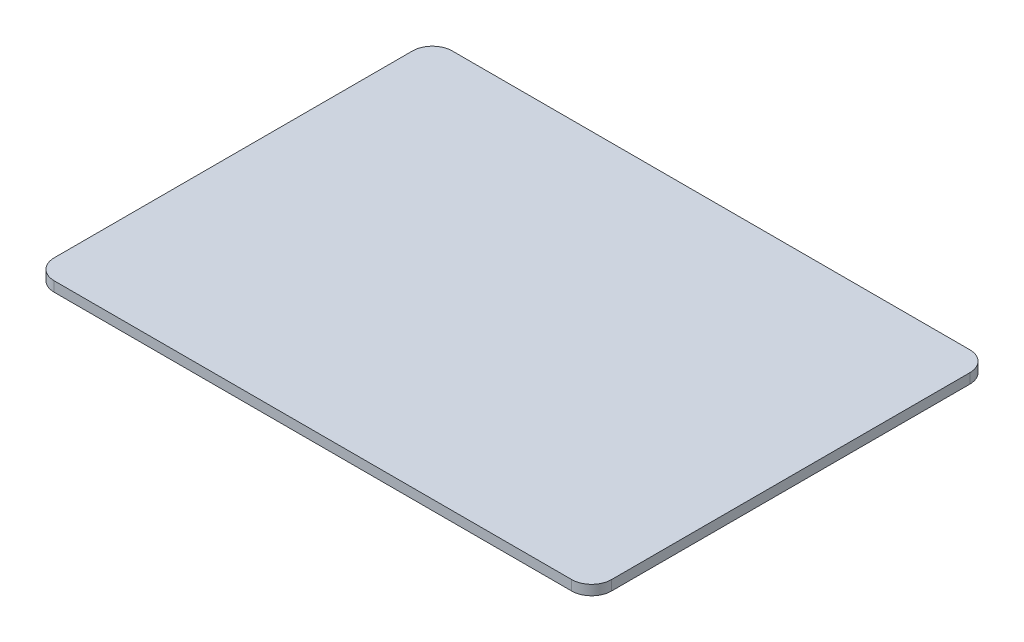
ISO-10303-21;
HEADER;
FILE_DESCRIPTION(('STEP AP214'),'2;1');
FILE_NAME('part.step','',(''),(''),'','','');
FILE_SCHEMA(('AUTOMOTIVE_DESIGN { 1 0 10303 214 1 1 1 1 }'));
ENDSEC;
DATA;
#1=APPLICATION_CONTEXT('core data for automotive mechanical design processes');
#2=APPLICATION_PROTOCOL_DEFINITION('international standard','automotive_design',2000,#1);
#3=PRODUCT_CONTEXT('',#1,'mechanical');
#4=PRODUCT('Part','Part','',(#3));
#5=PRODUCT_RELATED_PRODUCT_CATEGORY('part','',(#4));
#6=PRODUCT_DEFINITION_FORMATION('','',#4);
#7=PRODUCT_DEFINITION_CONTEXT('part definition',#1,'design');
#8=PRODUCT_DEFINITION('design','',#6,#7);
#9=PRODUCT_DEFINITION_SHAPE('','',#8);
#10=(LENGTH_UNIT() NAMED_UNIT(*) SI_UNIT(.MILLI.,.METRE.));
#11=(NAMED_UNIT(*) PLANE_ANGLE_UNIT() SI_UNIT($,.RADIAN.));
#12=(NAMED_UNIT(*) SI_UNIT($,.STERADIAN.) SOLID_ANGLE_UNIT());
#13=UNCERTAINTY_MEASURE_WITH_UNIT(LENGTH_MEASURE(1.E-05),#10,'distance_accuracy_value','');
#14=(GEOMETRIC_REPRESENTATION_CONTEXT(3) GLOBAL_UNCERTAINTY_ASSIGNED_CONTEXT((#13)) GLOBAL_UNIT_ASSIGNED_CONTEXT((#10,
#11,#12)) REPRESENTATION_CONTEXT('',''));
#15=CARTESIAN_POINT('',(0.,0.,0.));
#16=DIRECTION('',(0.,0.,1.));
#17=DIRECTION('',(1.,0.,0.));
#18=AXIS2_PLACEMENT_3D('',#15,#16,#17);
#19=CARTESIAN_POINT('',(177.8,6.35,-127.));
#20=DIRECTION('',(-1.,0.,0.));
#21=DIRECTION('',(0.,0.,1.));
#22=AXIS2_PLACEMENT_3D('',#19,#20,#21);
#23=PLANE('',#22);
#24=DIRECTION('',(0.,0.,-1.));
#25=VECTOR('',#24,1.);
#26=CARTESIAN_POINT('',(177.8,6.35,-127.));
#27=LINE('',#26,#25);
#28=CARTESIAN_POINT('',(177.8,6.35,114.3));
#29=VERTEX_POINT('',#28);
#30=CARTESIAN_POINT('',(177.8,6.35,-114.3));
#31=VERTEX_POINT('',#30);
#32=EDGE_CURVE('E125',#29,#31,#27,.T.);
#33=ORIENTED_EDGE('',*,*,#32,.F.);
#34=DIRECTION('',(0.,-1.,0.));
#35=VECTOR('',#34,1.);
#36=CARTESIAN_POINT('',(177.8,6.35,114.3));
#37=LINE('',#36,#35);
#38=CARTESIAN_POINT('',(177.8,0.,114.3));
#39=VERTEX_POINT('',#38);
#40=EDGE_CURVE('E109',#29,#39,#37,.T.);
#41=ORIENTED_EDGE('',*,*,#40,.T.);
#42=DIRECTION('',(0.,0.,-1.));
#43=VECTOR('',#42,1.);
#44=CARTESIAN_POINT('',(177.8,0.,-127.));
#45=LINE('',#44,#43);
#46=CARTESIAN_POINT('',(177.8,0.,-114.3));
#47=VERTEX_POINT('',#46);
#48=EDGE_CURVE('E122',#39,#47,#45,.T.);
#49=ORIENTED_EDGE('',*,*,#48,.T.);
#50=DIRECTION('',(0.,-1.,0.));
#51=VECTOR('',#50,1.);
#52=CARTESIAN_POINT('',(177.8,6.35,-114.3));
#53=LINE('',#52,#51);
#54=EDGE_CURVE('E128',#47,#31,#53,.F.);
#55=ORIENTED_EDGE('',*,*,#54,.T.);
#56=EDGE_LOOP('',(#33,#41,#49,#55));
#57=FACE_BOUND('',#56,.T.);
#58=ADVANCED_FACE('F38',(#57),#23,.F.);
#59=CARTESIAN_POINT('',(-177.8,6.35,-127.));
#60=DIRECTION('',(0.,0.,1.));
#61=DIRECTION('',(1.,0.,0.));
#62=AXIS2_PLACEMENT_3D('',#59,#60,#61);
#63=PLANE('',#62);
#64=DIRECTION('',(-1.,0.,0.));
#65=VECTOR('',#64,1.);
#66=CARTESIAN_POINT('',(-177.8,0.,-127.));
#67=LINE('',#66,#65);
#68=CARTESIAN_POINT('',(165.1,0.,-127.));
#69=VERTEX_POINT('',#68);
#70=CARTESIAN_POINT('',(-165.1,0.,-127.));
#71=VERTEX_POINT('',#70);
#72=EDGE_CURVE('E133',#69,#71,#67,.T.);
#73=ORIENTED_EDGE('',*,*,#72,.T.);
#74=DIRECTION('',(0.,-1.,0.));
#75=VECTOR('',#74,1.);
#76=CARTESIAN_POINT('',(-165.1,6.35,-127.));
#77=LINE('',#76,#75);
#78=CARTESIAN_POINT('',(-165.1,6.35,-127.));
#79=VERTEX_POINT('',#78);
#80=EDGE_CURVE('E11',#71,#79,#77,.F.);
#81=ORIENTED_EDGE('',*,*,#80,.T.);
#82=DIRECTION('',(-1.,0.,0.));
#83=VECTOR('',#82,1.);
#84=CARTESIAN_POINT('',(-177.8,6.35,-127.));
#85=LINE('',#84,#83);
#86=CARTESIAN_POINT('',(165.1,6.35,-127.));
#87=VERTEX_POINT('',#86);
#88=EDGE_CURVE('E185',#87,#79,#85,.T.);
#89=ORIENTED_EDGE('',*,*,#88,.F.);
#90=DIRECTION('',(0.,-1.,0.));
#91=VECTOR('',#90,1.);
#92=CARTESIAN_POINT('',(165.1,6.35,-127.));
#93=LINE('',#92,#91);
#94=EDGE_CURVE('E47',#87,#69,#93,.T.);
#95=ORIENTED_EDGE('',*,*,#94,.T.);
#96=EDGE_LOOP('',(#73,#81,#89,#95));
#97=FACE_BOUND('',#96,.T.);
#98=ADVANCED_FACE('F183',(#97),#63,.F.);
#99=CARTESIAN_POINT('',(-177.8,6.35,-127.));
#100=DIRECTION('',(1.,0.,0.));
#101=DIRECTION('',(0.,0.,-1.));
#102=AXIS2_PLACEMENT_3D('',#99,#100,#101);
#103=PLANE('',#102);
#104=DIRECTION('',(0.,0.,1.));
#105=VECTOR('',#104,1.);
#106=CARTESIAN_POINT('',(-177.8,0.,-127.));
#107=LINE('',#106,#105);
#108=CARTESIAN_POINT('',(-177.8,0.,-114.3));
#109=VERTEX_POINT('',#108);
#110=CARTESIAN_POINT('',(-177.8,0.,114.3));
#111=VERTEX_POINT('',#110);
#112=EDGE_CURVE('E137',#109,#111,#107,.T.);
#113=ORIENTED_EDGE('',*,*,#112,.T.);
#114=DIRECTION('',(0.,-1.,0.));
#115=VECTOR('',#114,1.);
#116=CARTESIAN_POINT('',(-177.8,6.35,114.3));
#117=LINE('',#116,#115);
#118=CARTESIAN_POINT('',(-177.8,6.35,114.3));
#119=VERTEX_POINT('',#118);
#120=EDGE_CURVE('E54',#111,#119,#117,.F.);
#121=ORIENTED_EDGE('',*,*,#120,.T.);
#122=DIRECTION('',(0.,0.,1.));
#123=VECTOR('',#122,1.);
#124=CARTESIAN_POINT('',(-177.8,6.35,-127.));
#125=LINE('',#124,#123);
#126=CARTESIAN_POINT('',(-177.8,6.35,-114.3));
#127=VERTEX_POINT('',#126);
#128=EDGE_CURVE('E193',#127,#119,#125,.T.);
#129=ORIENTED_EDGE('',*,*,#128,.F.);
#130=DIRECTION('',(0.,-1.,0.));
#131=VECTOR('',#130,1.);
#132=CARTESIAN_POINT('',(-177.8,6.35,-114.3));
#133=LINE('',#132,#131);
#134=EDGE_CURVE('E173',#127,#109,#133,.T.);
#135=ORIENTED_EDGE('',*,*,#134,.T.);
#136=EDGE_LOOP('',(#113,#121,#129,#135));
#137=FACE_BOUND('',#136,.T.);
#138=ADVANCED_FACE('F192',(#137),#103,.F.);
#139=CARTESIAN_POINT('',(-177.8,6.35,127.));
#140=DIRECTION('',(0.,0.,-1.));
#141=DIRECTION('',(-1.,0.,0.));
#142=AXIS2_PLACEMENT_3D('',#139,#140,#141);
#143=PLANE('',#142);
#144=DIRECTION('',(1.,0.,0.));
#145=VECTOR('',#144,1.);
#146=CARTESIAN_POINT('',(-177.8,0.,127.));
#147=LINE('',#146,#145);
#148=CARTESIAN_POINT('',(-165.1,0.,127.));
#149=VERTEX_POINT('',#148);
#150=CARTESIAN_POINT('',(165.1,0.,127.));
#151=VERTEX_POINT('',#150);
#152=EDGE_CURVE('E145',#149,#151,#147,.T.);
#153=ORIENTED_EDGE('',*,*,#152,.T.);
#154=DIRECTION('',(0.,-1.,0.));
#155=VECTOR('',#154,1.);
#156=CARTESIAN_POINT('',(165.1,6.35,127.));
#157=LINE('',#156,#155);
#158=CARTESIAN_POINT('',(165.1,6.35,127.));
#159=VERTEX_POINT('',#158);
#160=EDGE_CURVE('E110',#151,#159,#157,.F.);
#161=ORIENTED_EDGE('',*,*,#160,.T.);
#162=DIRECTION('',(1.,0.,0.));
#163=VECTOR('',#162,1.);
#164=CARTESIAN_POINT('',(-177.8,6.35,127.));
#165=LINE('',#164,#163);
#166=CARTESIAN_POINT('',(-165.1,6.35,127.));
#167=VERTEX_POINT('',#166);
#168=EDGE_CURVE('E140',#167,#159,#165,.T.);
#169=ORIENTED_EDGE('',*,*,#168,.F.);
#170=DIRECTION('',(0.,-1.,0.));
#171=VECTOR('',#170,1.);
#172=CARTESIAN_POINT('',(-165.1,6.35,127.));
#173=LINE('',#172,#171);
#174=EDGE_CURVE('E116',#167,#149,#173,.T.);
#175=ORIENTED_EDGE('',*,*,#174,.T.);
#176=EDGE_LOOP('',(#153,#161,#169,#175));
#177=FACE_BOUND('',#176,.T.);
#178=ADVANCED_FACE('F225',(#177),#143,.F.);
#179=CARTESIAN_POINT('',(0.,6.35,0.));
#180=DIRECTION('',(0.,1.,0.));
#181=DIRECTION('',(0.,0.,1.));
#182=AXIS2_PLACEMENT_3D('',#179,#180,#181);
#183=PLANE('',#182);
#184=ORIENTED_EDGE('',*,*,#168,.T.);
#185=CARTESIAN_POINT('',(165.1,6.35,114.3));
#186=DIRECTION('',(0.,1.,0.));
#187=DIRECTION('',(0.,0.,1.));
#188=AXIS2_PLACEMENT_3D('',#185,#186,#187);
#189=CIRCLE('',#188,12.7);
#190=EDGE_CURVE('E170',#159,#29,#189,.T.);
#191=ORIENTED_EDGE('',*,*,#190,.T.);
#192=ORIENTED_EDGE('',*,*,#32,.T.);
#193=CARTESIAN_POINT('',(165.1,6.35,-114.3));
#194=DIRECTION('',(0.,1.,0.));
#195=DIRECTION('',(0.,0.,1.));
#196=AXIS2_PLACEMENT_3D('',#193,#194,#195);
#197=CIRCLE('',#196,12.7);
#198=EDGE_CURVE('E162',#31,#87,#197,.T.);
#199=ORIENTED_EDGE('',*,*,#198,.T.);
#200=ORIENTED_EDGE('',*,*,#88,.T.);
#201=CARTESIAN_POINT('',(-165.1,6.35,-114.3));
#202=DIRECTION('',(0.,1.,0.));
#203=DIRECTION('',(0.,0.,1.));
#204=AXIS2_PLACEMENT_3D('',#201,#202,#203);
#205=CIRCLE('',#204,12.7);
#206=EDGE_CURVE('E61',#79,#127,#205,.T.);
#207=ORIENTED_EDGE('',*,*,#206,.T.);
#208=ORIENTED_EDGE('',*,*,#128,.T.);
#209=CARTESIAN_POINT('',(-165.1,6.35,114.3));
#210=DIRECTION('',(0.,1.,0.));
#211=DIRECTION('',(0.,0.,1.));
#212=AXIS2_PLACEMENT_3D('',#209,#210,#211);
#213=CIRCLE('',#212,12.7);
#214=EDGE_CURVE('E167',#119,#167,#213,.T.);
#215=ORIENTED_EDGE('',*,*,#214,.T.);
#216=EDGE_LOOP('',(#184,#191,#192,#199,#200,#207,#208,#215));
#217=FACE_BOUND('',#216,.T.);
#218=ADVANCED_FACE('F202',(#217),#183,.T.);
#219=CARTESIAN_POINT('',(0.,0.,0.));
#220=DIRECTION('',(0.,1.,0.));
#221=DIRECTION('',(0.,0.,1.));
#222=AXIS2_PLACEMENT_3D('',#219,#220,#221);
#223=PLANE('',#222);
#224=ORIENTED_EDGE('',*,*,#48,.F.);
#225=CARTESIAN_POINT('',(165.1,0.,114.3));
#226=DIRECTION('',(0.,1.,0.));
#227=DIRECTION('',(0.,0.,1.));
#228=AXIS2_PLACEMENT_3D('',#225,#226,#227);
#229=CIRCLE('',#228,12.7);
#230=EDGE_CURVE('E105',#39,#151,#229,.F.);
#231=ORIENTED_EDGE('',*,*,#230,.T.);
#232=ORIENTED_EDGE('',*,*,#152,.F.);
#233=CARTESIAN_POINT('',(-165.1,0.,114.3));
#234=DIRECTION('',(0.,1.,0.));
#235=DIRECTION('',(0.,0.,1.));
#236=AXIS2_PLACEMENT_3D('',#233,#234,#235);
#237=CIRCLE('',#236,12.7);
#238=EDGE_CURVE('E117',#149,#111,#237,.F.);
#239=ORIENTED_EDGE('',*,*,#238,.T.);
#240=ORIENTED_EDGE('',*,*,#112,.F.);
#241=CARTESIAN_POINT('',(-165.1,0.,-114.3));
#242=DIRECTION('',(0.,1.,0.));
#243=DIRECTION('',(0.,0.,1.));
#244=AXIS2_PLACEMENT_3D('',#241,#242,#243);
#245=CIRCLE('',#244,12.7);
#246=EDGE_CURVE('E152',#109,#71,#245,.F.);
#247=ORIENTED_EDGE('',*,*,#246,.T.);
#248=ORIENTED_EDGE('',*,*,#72,.F.);
#249=CARTESIAN_POINT('',(165.1,0.,-114.3));
#250=DIRECTION('',(0.,1.,0.));
#251=DIRECTION('',(0.,0.,1.));
#252=AXIS2_PLACEMENT_3D('',#249,#250,#251);
#253=CIRCLE('',#252,12.7);
#254=EDGE_CURVE('E127',#69,#47,#253,.F.);
#255=ORIENTED_EDGE('',*,*,#254,.T.);
#256=EDGE_LOOP('',(#224,#231,#232,#239,#240,#247,#248,#255));
#257=FACE_BOUND('',#256,.T.);
#258=ADVANCED_FACE('F130',(#257),#223,.F.);
#259=CARTESIAN_POINT('',(165.1,6.35,114.3));
#260=DIRECTION('',(0.,-1.,0.));
#261=DIRECTION('',(0.,0.,-1.));
#262=AXIS2_PLACEMENT_3D('',#259,#260,#261);
#263=CYLINDRICAL_SURFACE('',#262,12.7);
#264=ORIENTED_EDGE('',*,*,#190,.F.);
#265=ORIENTED_EDGE('',*,*,#160,.F.);
#266=ORIENTED_EDGE('',*,*,#230,.F.);
#267=ORIENTED_EDGE('',*,*,#40,.F.);
#268=EDGE_LOOP('',(#264,#265,#266,#267));
#269=FACE_BOUND('',#268,.T.);
#270=ADVANCED_FACE('F108',(#269),#263,.T.);
#271=CARTESIAN_POINT('',(-165.1,6.35,114.3));
#272=DIRECTION('',(0.,-1.,0.));
#273=DIRECTION('',(0.,0.,-1.));
#274=AXIS2_PLACEMENT_3D('',#271,#272,#273);
#275=CYLINDRICAL_SURFACE('',#274,12.7);
#276=ORIENTED_EDGE('',*,*,#214,.F.);
#277=ORIENTED_EDGE('',*,*,#120,.F.);
#278=ORIENTED_EDGE('',*,*,#238,.F.);
#279=ORIENTED_EDGE('',*,*,#174,.F.);
#280=EDGE_LOOP('',(#276,#277,#278,#279));
#281=FACE_BOUND('',#280,.T.);
#282=ADVANCED_FACE('F207',(#281),#275,.T.);
#283=CARTESIAN_POINT('',(-165.1,6.35,-114.3));
#284=DIRECTION('',(0.,-1.,0.));
#285=DIRECTION('',(0.,0.,-1.));
#286=AXIS2_PLACEMENT_3D('',#283,#284,#285);
#287=CYLINDRICAL_SURFACE('',#286,12.7);
#288=ORIENTED_EDGE('',*,*,#206,.F.);
#289=ORIENTED_EDGE('',*,*,#80,.F.);
#290=ORIENTED_EDGE('',*,*,#246,.F.);
#291=ORIENTED_EDGE('',*,*,#134,.F.);
#292=EDGE_LOOP('',(#288,#289,#290,#291));
#293=FACE_BOUND('',#292,.T.);
#294=ADVANCED_FACE('F191',(#293),#287,.T.);
#295=CARTESIAN_POINT('',(165.1,6.35,-114.3));
#296=DIRECTION('',(0.,-1.,0.));
#297=DIRECTION('',(0.,0.,-1.));
#298=AXIS2_PLACEMENT_3D('',#295,#296,#297);
#299=CYLINDRICAL_SURFACE('',#298,12.7);
#300=ORIENTED_EDGE('',*,*,#198,.F.);
#301=ORIENTED_EDGE('',*,*,#54,.F.);
#302=ORIENTED_EDGE('',*,*,#254,.F.);
#303=ORIENTED_EDGE('',*,*,#94,.F.);
#304=EDGE_LOOP('',(#300,#301,#302,#303));
#305=FACE_BOUND('',#304,.T.);
#306=ADVANCED_FACE('F40',(#305),#299,.T.);
#307=CLOSED_SHELL('',(#58,#98,#138,#178,#218,#258,#270,#282,#294,#306));
#308=MANIFOLD_SOLID_BREP('B2',#307);
#309=ADVANCED_BREP_SHAPE_REPRESENTATION('',(#18,#308),#14);
#310=SHAPE_DEFINITION_REPRESENTATION(#9,#309);
ENDSEC;
END-ISO-10303-21;
